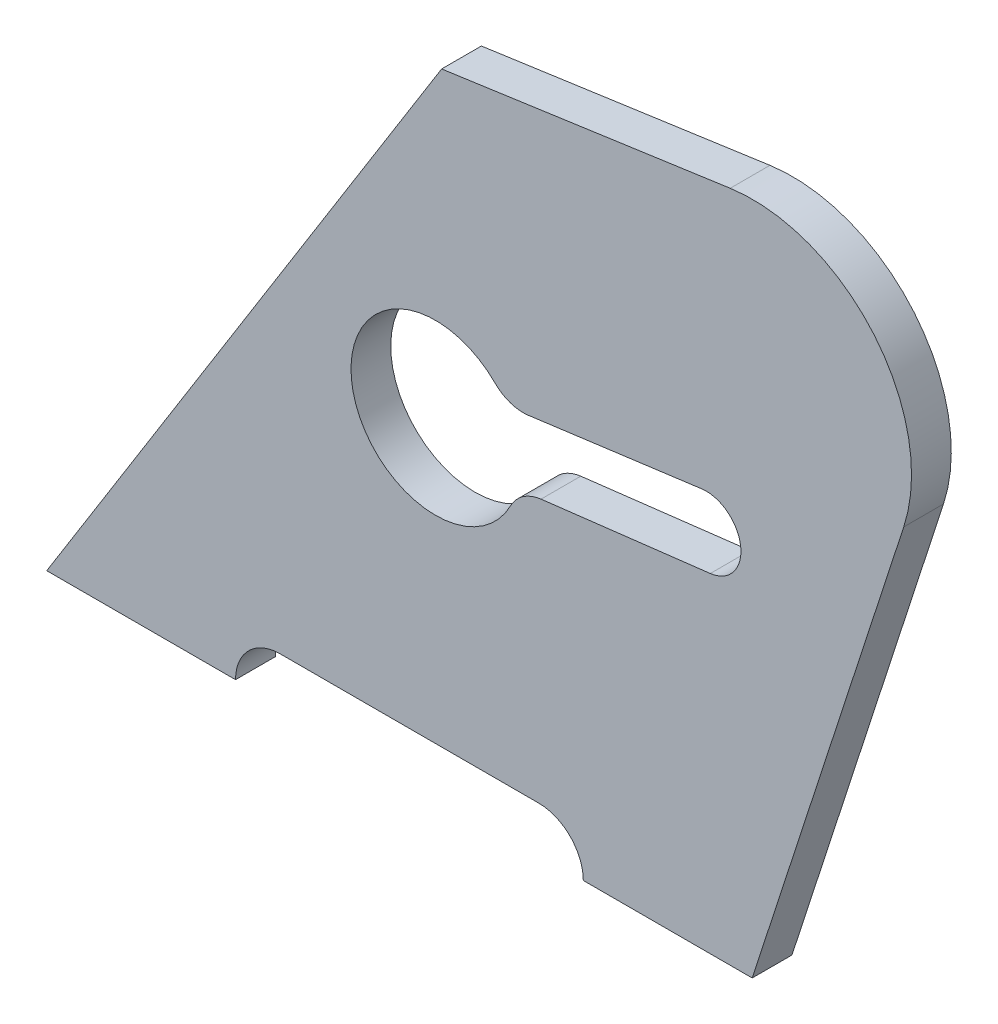
ISO-10303-21;
HEADER;
FILE_DESCRIPTION(('STEP AP214'),'2;1');
FILE_NAME('part.step','',(''),(''),'','','');
FILE_SCHEMA(('AUTOMOTIVE_DESIGN { 1 0 10303 214 1 1 1 1 }'));
ENDSEC;
DATA;
#1=APPLICATION_CONTEXT('core data for automotive mechanical design processes');
#2=APPLICATION_PROTOCOL_DEFINITION('international standard','automotive_design',2000,#1);
#3=PRODUCT_CONTEXT('',#1,'mechanical');
#4=PRODUCT('Part','Part','',(#3));
#5=PRODUCT_RELATED_PRODUCT_CATEGORY('part','',(#4));
#6=PRODUCT_DEFINITION_FORMATION('','',#4);
#7=PRODUCT_DEFINITION_CONTEXT('part definition',#1,'design');
#8=PRODUCT_DEFINITION('design','',#6,#7);
#9=PRODUCT_DEFINITION_SHAPE('','',#8);
#10=(LENGTH_UNIT() NAMED_UNIT(*) SI_UNIT(.MILLI.,.METRE.));
#11=(NAMED_UNIT(*) PLANE_ANGLE_UNIT() SI_UNIT($,.RADIAN.));
#12=(NAMED_UNIT(*) SI_UNIT($,.STERADIAN.) SOLID_ANGLE_UNIT());
#13=UNCERTAINTY_MEASURE_WITH_UNIT(LENGTH_MEASURE(1.E-05),#10,'distance_accuracy_value','');
#14=(GEOMETRIC_REPRESENTATION_CONTEXT(3) GLOBAL_UNCERTAINTY_ASSIGNED_CONTEXT((#13)) GLOBAL_UNIT_ASSIGNED_CONTEXT((#10,
#11,#12)) REPRESENTATION_CONTEXT('',''));
#15=CARTESIAN_POINT('',(0.,0.,0.));
#16=DIRECTION('',(0.,0.,1.));
#17=DIRECTION('',(1.,0.,0.));
#18=AXIS2_PLACEMENT_3D('',#15,#16,#17);
#19=CARTESIAN_POINT('',(100.444452501199,54.2812565209508,8.));
#20=DIRECTION('',(0.,0.,-1.));
#21=DIRECTION('',(-1.,0.,0.));
#22=AXIS2_PLACEMENT_3D('',#19,#20,#21);
#23=CYLINDRICAL_SURFACE('',#22,7.99999999999999);
#24=CARTESIAN_POINT('',(100.444452501199,54.2812565209508,0.));
#25=DIRECTION('',(0.,0.,1.));
#26=DIRECTION('',(1.,0.,0.));
#27=AXIS2_PLACEMENT_3D('',#24,#25,#26);
#28=CIRCLE('',#27,7.99999999999999);
#29=CARTESIAN_POINT('',(99.4956641977497,62.2247948229443,0.));
#30=VERTEX_POINT('',#29);
#31=CARTESIAN_POINT('',(93.3405180268182,57.9601306671678,0.));
#32=VERTEX_POINT('',#31);
#33=EDGE_CURVE('E204',#30,#32,#28,.T.);
#34=ORIENTED_EDGE('',*,*,#33,.T.);
#35=DIRECTION('',(0.,0.,-1.));
#36=VECTOR('',#35,1.);
#37=CARTESIAN_POINT('',(93.3405180268182,57.9601306671678,8.));
#38=LINE('',#37,#36);
#39=CARTESIAN_POINT('',(93.3405180268182,57.9601306671678,8.));
#40=VERTEX_POINT('',#39);
#41=EDGE_CURVE('E11',#40,#32,#38,.T.);
#42=ORIENTED_EDGE('',*,*,#41,.F.);
#43=CARTESIAN_POINT('',(100.444452501199,54.2812565209508,8.));
#44=DIRECTION('',(0.,0.,1.));
#45=DIRECTION('',(1.,0.,0.));
#46=AXIS2_PLACEMENT_3D('',#43,#44,#45);
#47=CIRCLE('',#46,7.99999999999999);
#48=CARTESIAN_POINT('',(99.4956641977497,62.2247948229443,8.));
#49=VERTEX_POINT('',#48);
#50=EDGE_CURVE('E301',#49,#40,#47,.T.);
#51=ORIENTED_EDGE('',*,*,#50,.F.);
#52=DIRECTION('',(0.,0.,-1.));
#53=VECTOR('',#52,1.);
#54=CARTESIAN_POINT('',(99.4956641977497,62.2247948229443,8.));
#55=LINE('',#54,#53);
#56=EDGE_CURVE('E216',#49,#30,#55,.T.);
#57=ORIENTED_EDGE('',*,*,#56,.T.);
#58=EDGE_LOOP('',(#34,#42,#51,#57));
#59=FACE_BOUND('',#58,.T.);
#60=ADVANCED_FACE('F43',(#59),#23,.T.);
#61=CARTESIAN_POINT('',(78.244657268759,65.7777382278788,8.));
#62=DIRECTION('',(0.,0.,-1.));
#63=DIRECTION('',(-1.,0.,0.));
#64=AXIS2_PLACEMENT_3D('',#61,#62,#63);
#65=CYLINDRICAL_SURFACE('',#64,17.);
#66=CARTESIAN_POINT('',(78.244657268759,65.7777382278788,0.));
#67=DIRECTION('',(0.,0.,1.));
#68=DIRECTION('',(1.,0.,0.));
#69=AXIS2_PLACEMENT_3D('',#66,#67,#68);
#70=CIRCLE('',#69,17.);
#71=CARTESIAN_POINT('',(90.2430889891393,77.8208954655542,0.));
#72=VERTEX_POINT('',#71);
#73=EDGE_CURVE('E210',#72,#32,#70,.T.);
#74=ORIENTED_EDGE('',*,*,#73,.F.);
#75=DIRECTION('',(0.,0.,-1.));
#76=VECTOR('',#75,1.);
#77=CARTESIAN_POINT('',(90.2430889891393,77.8208954655542,8.));
#78=LINE('',#77,#76);
#79=CARTESIAN_POINT('',(90.2430889891393,77.8208954655542,8.));
#80=VERTEX_POINT('',#79);
#81=EDGE_CURVE('E52',#80,#72,#78,.T.);
#82=ORIENTED_EDGE('',*,*,#81,.F.);
#83=CARTESIAN_POINT('',(78.244657268759,65.7777382278788,8.));
#84=DIRECTION('',(0.,0.,1.));
#85=DIRECTION('',(1.,0.,0.));
#86=AXIS2_PLACEMENT_3D('',#83,#84,#85);
#87=CIRCLE('',#86,17.);
#88=EDGE_CURVE('E304',#80,#40,#87,.T.);
#89=ORIENTED_EDGE('',*,*,#88,.T.);
#90=ORIENTED_EDGE('',*,*,#41,.T.);
#91=EDGE_LOOP('',(#74,#82,#89,#90));
#92=FACE_BOUND('',#91,.T.);
#93=ADVANCED_FACE('F330',(#92),#65,.F.);
#94=CARTESIAN_POINT('',(95.88940979873,83.4882635774014,8.));
#95=DIRECTION('',(0.,0.,-1.));
#96=DIRECTION('',(-1.,0.,0.));
#97=AXIS2_PLACEMENT_3D('',#94,#95,#96);
#98=CYLINDRICAL_SURFACE('',#97,8.00000000000002);
#99=CARTESIAN_POINT('',(95.88940979873,83.4882635774014,0.));
#100=DIRECTION('',(0.,0.,1.));
#101=DIRECTION('',(1.,0.,0.));
#102=AXIS2_PLACEMENT_3D('',#99,#100,#101);
#103=CIRCLE('',#102,8.00000000000002);
#104=CARTESIAN_POINT('',(96.941453956969,75.5577400707774,0.));
#105=VERTEX_POINT('',#104);
#106=EDGE_CURVE('E206',#105,#72,#103,.F.);
#107=ORIENTED_EDGE('',*,*,#106,.F.);
#108=DIRECTION('',(0.,0.,-1.));
#109=VECTOR('',#108,1.);
#110=CARTESIAN_POINT('',(96.941453956969,75.5577400707774,8.));
#111=LINE('',#110,#109);
#112=CARTESIAN_POINT('',(96.941453956969,75.5577400707774,8.));
#113=VERTEX_POINT('',#112);
#114=EDGE_CURVE('E167',#113,#105,#111,.T.);
#115=ORIENTED_EDGE('',*,*,#114,.F.);
#116=CARTESIAN_POINT('',(95.88940979873,83.4882635774014,8.));
#117=DIRECTION('',(0.,0.,1.));
#118=DIRECTION('',(1.,0.,0.));
#119=AXIS2_PLACEMENT_3D('',#116,#117,#118);
#120=CIRCLE('',#119,8.00000000000002);
#121=EDGE_CURVE('E174',#113,#80,#120,.F.);
#122=ORIENTED_EDGE('',*,*,#121,.T.);
#123=ORIENTED_EDGE('',*,*,#81,.T.);
#124=EDGE_LOOP('',(#107,#115,#122,#123));
#125=FACE_BOUND('',#124,.T.);
#126=ADVANCED_FACE('F309',(#125),#98,.T.);
#127=CARTESIAN_POINT('',(-8.17349122941711,61.6134444723113,8.));
#128=DIRECTION('',(0.131505519779873,-0.991315438327995,0.));
#129=DIRECTION('',(0.991315438327995,0.131505519779873,0.));
#130=AXIS2_PLACEMENT_3D('',#127,#128,#129);
#131=PLANE('',#130);
#132=DIRECTION('',(-0.991315438327995,-0.131505519779873,0.));
#133=VECTOR('',#132,1.);
#134=CARTESIAN_POINT('',(-8.17349122941711,61.6134444723113,0.));
#135=LINE('',#134,#133);
#136=CARTESIAN_POINT('',(131.814885043741,80.183965492333,0.));
#137=VERTEX_POINT('',#136);
#138=EDGE_CURVE('E165',#137,#105,#135,.T.);
#139=ORIENTED_EDGE('',*,*,#138,.F.);
#140=DIRECTION('',(0.,0.,-1.));
#141=VECTOR('',#140,1.);
#142=CARTESIAN_POINT('',(131.814885043741,80.183965492333,8.));
#143=LINE('',#142,#141);
#144=CARTESIAN_POINT('',(131.814885043741,80.183965492333,8.));
#145=VERTEX_POINT('',#144);
#146=EDGE_CURVE('E160',#145,#137,#143,.T.);
#147=ORIENTED_EDGE('',*,*,#146,.F.);
#148=DIRECTION('',(-0.991315438327995,-0.131505519779873,0.));
#149=VECTOR('',#148,1.);
#150=CARTESIAN_POINT('',(-8.17349122941711,61.6134444723113,8.));
#151=LINE('',#150,#149);
#152=EDGE_CURVE('E158',#145,#113,#151,.T.);
#153=ORIENTED_EDGE('',*,*,#152,.T.);
#154=ORIENTED_EDGE('',*,*,#114,.T.);
#155=EDGE_LOOP('',(#139,#147,#153,#154));
#156=FACE_BOUND('',#155,.T.);
#157=ADVANCED_FACE('F159',(#156),#131,.T.);
#158=CARTESIAN_POINT('',(132.7354236822,73.244757424037,8.));
#159=DIRECTION('',(0.,0.,-1.));
#160=DIRECTION('',(-1.,0.,0.));
#161=AXIS2_PLACEMENT_3D('',#158,#159,#160);
#162=CYLINDRICAL_SURFACE('',#161,6.99999999999999);
#163=CARTESIAN_POINT('',(132.7354236822,73.244757424037,0.));
#164=DIRECTION('',(0.,0.,1.));
#165=DIRECTION('',(1.,0.,0.));
#166=AXIS2_PLACEMENT_3D('',#163,#164,#165);
#167=CIRCLE('',#166,6.99999999999999);
#168=CARTESIAN_POINT('',(133.565613447718,66.2941614097928,0.));
#169=VERTEX_POINT('',#168);
#170=EDGE_CURVE('E215',#169,#137,#167,.T.);
#171=ORIENTED_EDGE('',*,*,#170,.F.);
#172=DIRECTION('',(0.,0.,-1.));
#173=VECTOR('',#172,1.);
#174=CARTESIAN_POINT('',(133.565613447718,66.2941614097928,8.));
#175=LINE('',#174,#173);
#176=CARTESIAN_POINT('',(133.565613447718,66.2941614097928,8.));
#177=VERTEX_POINT('',#176);
#178=EDGE_CURVE('E106',#177,#169,#175,.T.);
#179=ORIENTED_EDGE('',*,*,#178,.F.);
#180=CARTESIAN_POINT('',(132.7354236822,73.244757424037,8.));
#181=DIRECTION('',(0.,0.,1.));
#182=DIRECTION('',(1.,0.,0.));
#183=AXIS2_PLACEMENT_3D('',#180,#181,#182);
#184=CIRCLE('',#183,6.99999999999999);
#185=EDGE_CURVE('E173',#177,#145,#184,.T.);
#186=ORIENTED_EDGE('',*,*,#185,.T.);
#187=ORIENTED_EDGE('',*,*,#146,.T.);
#188=EDGE_LOOP('',(#171,#179,#186,#187));
#189=FACE_BOUND('',#188,.T.);
#190=ADVANCED_FACE('F176',(#189),#162,.F.);
#191=CARTESIAN_POINT('',(0.,0.,8.));
#192=DIRECTION('',(-0.848048096156428,0.529919264233202,0.));
#193=DIRECTION('',(-0.529919264233202,-0.848048096156428,0.));
#194=AXIS2_PLACEMENT_3D('',#191,#192,#193);
#195=PLANE('',#194);
#196=DIRECTION('',(0.529919264233202,0.848048096156428,0.));
#197=VECTOR('',#196,1.);
#198=CARTESIAN_POINT('',(0.,0.,0.));
#199=LINE('',#198,#197);
#200=CARTESIAN_POINT('',(0.,0.,0.));
#201=VERTEX_POINT('',#200);
#202=CARTESIAN_POINT('',(79.4878896349804,127.207214423464,0.));
#203=VERTEX_POINT('',#202);
#204=EDGE_CURVE('E185',#201,#203,#199,.T.);
#205=ORIENTED_EDGE('',*,*,#204,.F.);
#206=DIRECTION('',(0.,0.,-1.));
#207=VECTOR('',#206,1.);
#208=CARTESIAN_POINT('',(0.,0.,8.));
#209=LINE('',#208,#207);
#210=CARTESIAN_POINT('',(0.,0.,8.));
#211=VERTEX_POINT('',#210);
#212=EDGE_CURVE('E50',#211,#201,#209,.T.);
#213=ORIENTED_EDGE('',*,*,#212,.F.);
#214=DIRECTION('',(0.529919264233202,0.848048096156428,0.));
#215=VECTOR('',#214,1.);
#216=CARTESIAN_POINT('',(0.,0.,8.));
#217=LINE('',#216,#215);
#218=CARTESIAN_POINT('',(79.4878896349804,127.207214423464,8.));
#219=VERTEX_POINT('',#218);
#220=EDGE_CURVE('E220',#211,#219,#217,.T.);
#221=ORIENTED_EDGE('',*,*,#220,.T.);
#222=DIRECTION('',(0.,0.,-1.));
#223=VECTOR('',#222,1.);
#224=CARTESIAN_POINT('',(79.4878896349804,127.207214423464,8.));
#225=LINE('',#224,#223);
#226=EDGE_CURVE('E178',#219,#203,#225,.T.);
#227=ORIENTED_EDGE('',*,*,#226,.T.);
#228=EDGE_LOOP('',(#205,#213,#221,#227));
#229=FACE_BOUND('',#228,.T.);
#230=ADVANCED_FACE('F44',(#229),#195,.T.);
#231=CARTESIAN_POINT('',(0.,0.,8.));
#232=DIRECTION('',(0.,1.,0.));
#233=DIRECTION('',(0.,0.,1.));
#234=AXIS2_PLACEMENT_3D('',#231,#232,#233);
#235=PLANE('',#234);
#236=DIRECTION('',(1.,0.,0.));
#237=VECTOR('',#236,1.);
#238=CARTESIAN_POINT('',(0.,0.,0.));
#239=LINE('',#238,#237);
#240=CARTESIAN_POINT('',(38.,0.,0.));
#241=VERTEX_POINT('',#240);
#242=EDGE_CURVE('E184',#201,#241,#239,.T.);
#243=ORIENTED_EDGE('',*,*,#242,.T.);
#244=DIRECTION('',(0.,0.,-1.));
#245=VECTOR('',#244,1.);
#246=CARTESIAN_POINT('',(38.,0.,8.));
#247=LINE('',#246,#245);
#248=CARTESIAN_POINT('',(38.,0.,8.));
#249=VERTEX_POINT('',#248);
#250=EDGE_CURVE('E236',#249,#241,#247,.T.);
#251=ORIENTED_EDGE('',*,*,#250,.F.);
#252=DIRECTION('',(1.,0.,0.));
#253=VECTOR('',#252,1.);
#254=CARTESIAN_POINT('',(0.,0.,8.));
#255=LINE('',#254,#253);
#256=EDGE_CURVE('E246',#211,#249,#255,.T.);
#257=ORIENTED_EDGE('',*,*,#256,.F.);
#258=ORIENTED_EDGE('',*,*,#212,.T.);
#259=EDGE_LOOP('',(#243,#251,#257,#258));
#260=FACE_BOUND('',#259,.T.);
#261=ADVANCED_FACE('F250',(#260),#235,.F.);
#262=CARTESIAN_POINT('',(47.,0.,8.));
#263=DIRECTION('',(0.,0.,-1.));
#264=DIRECTION('',(-1.,0.,0.));
#265=AXIS2_PLACEMENT_3D('',#262,#263,#264);
#266=CYLINDRICAL_SURFACE('',#265,9.);
#267=CARTESIAN_POINT('',(47.,0.,0.));
#268=DIRECTION('',(0.,0.,1.));
#269=DIRECTION('',(1.,0.,0.));
#270=AXIS2_PLACEMENT_3D('',#267,#268,#269);
#271=CIRCLE('',#270,9.);
#272=CARTESIAN_POINT('',(47.,9.,0.));
#273=VERTEX_POINT('',#272);
#274=EDGE_CURVE('E190',#241,#273,#271,.F.);
#275=ORIENTED_EDGE('',*,*,#274,.T.);
#276=DIRECTION('',(0.,0.,-1.));
#277=VECTOR('',#276,1.);
#278=CARTESIAN_POINT('',(47.,9.,8.));
#279=LINE('',#278,#277);
#280=CARTESIAN_POINT('',(47.,9.,8.));
#281=VERTEX_POINT('',#280);
#282=EDGE_CURVE('E240',#281,#273,#279,.T.);
#283=ORIENTED_EDGE('',*,*,#282,.F.);
#284=CARTESIAN_POINT('',(47.,0.,8.));
#285=DIRECTION('',(0.,0.,1.));
#286=DIRECTION('',(1.,0.,0.));
#287=AXIS2_PLACEMENT_3D('',#284,#285,#286);
#288=CIRCLE('',#287,9.);
#289=EDGE_CURVE('E289',#249,#281,#288,.F.);
#290=ORIENTED_EDGE('',*,*,#289,.F.);
#291=ORIENTED_EDGE('',*,*,#250,.T.);
#292=EDGE_LOOP('',(#275,#283,#290,#291));
#293=FACE_BOUND('',#292,.T.);
#294=ADVANCED_FACE('F288',(#293),#266,.F.);
#295=CARTESIAN_POINT('',(0.,9.,8.));
#296=DIRECTION('',(0.,1.,0.));
#297=DIRECTION('',(-1.,0.,0.));
#298=AXIS2_PLACEMENT_3D('',#295,#296,#297);
#299=PLANE('',#298);
#300=DIRECTION('',(1.,0.,0.));
#301=VECTOR('',#300,1.);
#302=CARTESIAN_POINT('',(0.,9.,0.));
#303=LINE('',#302,#301);
#304=CARTESIAN_POINT('',(99.,9.,0.));
#305=VERTEX_POINT('',#304);
#306=EDGE_CURVE('E188',#273,#305,#303,.T.);
#307=ORIENTED_EDGE('',*,*,#306,.T.);
#308=DIRECTION('',(0.,0.,-1.));
#309=VECTOR('',#308,1.);
#310=CARTESIAN_POINT('',(99.,9.,8.));
#311=LINE('',#310,#309);
#312=CARTESIAN_POINT('',(99.,9.,8.));
#313=VERTEX_POINT('',#312);
#314=EDGE_CURVE('E233',#313,#305,#311,.T.);
#315=ORIENTED_EDGE('',*,*,#314,.F.);
#316=DIRECTION('',(1.,0.,0.));
#317=VECTOR('',#316,1.);
#318=CARTESIAN_POINT('',(0.,9.,8.));
#319=LINE('',#318,#317);
#320=EDGE_CURVE('E287',#281,#313,#319,.T.);
#321=ORIENTED_EDGE('',*,*,#320,.F.);
#322=ORIENTED_EDGE('',*,*,#282,.T.);
#323=EDGE_LOOP('',(#307,#315,#321,#322));
#324=FACE_BOUND('',#323,.T.);
#325=ADVANCED_FACE('F283',(#324),#299,.F.);
#326=CARTESIAN_POINT('',(99.,0.,8.));
#327=DIRECTION('',(0.,0.,-1.));
#328=DIRECTION('',(-1.,0.,0.));
#329=AXIS2_PLACEMENT_3D('',#326,#327,#328);
#330=CYLINDRICAL_SURFACE('',#329,9.);
#331=CARTESIAN_POINT('',(99.,0.,0.));
#332=DIRECTION('',(0.,0.,1.));
#333=DIRECTION('',(1.,0.,0.));
#334=AXIS2_PLACEMENT_3D('',#331,#332,#333);
#335=CIRCLE('',#334,9.);
#336=CARTESIAN_POINT('',(108.,0.,0.));
#337=VERTEX_POINT('',#336);
#338=EDGE_CURVE('E192',#305,#337,#335,.F.);
#339=ORIENTED_EDGE('',*,*,#338,.T.);
#340=DIRECTION('',(0.,0.,-1.));
#341=VECTOR('',#340,1.);
#342=CARTESIAN_POINT('',(108.,0.,8.));
#343=LINE('',#342,#341);
#344=CARTESIAN_POINT('',(108.,0.,8.));
#345=VERTEX_POINT('',#344);
#346=EDGE_CURVE('E231',#345,#337,#343,.T.);
#347=ORIENTED_EDGE('',*,*,#346,.F.);
#348=CARTESIAN_POINT('',(99.,0.,8.));
#349=DIRECTION('',(0.,0.,1.));
#350=DIRECTION('',(1.,0.,0.));
#351=AXIS2_PLACEMENT_3D('',#348,#349,#350);
#352=CIRCLE('',#351,9.);
#353=EDGE_CURVE('E282',#313,#345,#352,.F.);
#354=ORIENTED_EDGE('',*,*,#353,.F.);
#355=ORIENTED_EDGE('',*,*,#314,.T.);
#356=EDGE_LOOP('',(#339,#347,#354,#355));
#357=FACE_BOUND('',#356,.T.);
#358=ADVANCED_FACE('F279',(#357),#330,.F.);
#359=CARTESIAN_POINT('',(0.,0.,8.));
#360=DIRECTION('',(0.,1.,0.));
#361=DIRECTION('',(0.,0.,1.));
#362=AXIS2_PLACEMENT_3D('',#359,#360,#361);
#363=PLANE('',#362);
#364=DIRECTION('',(1.,0.,0.));
#365=VECTOR('',#364,1.);
#366=CARTESIAN_POINT('',(0.,0.,0.));
#367=LINE('',#366,#365);
#368=CARTESIAN_POINT('',(142.,0.,0.));
#369=VERTEX_POINT('',#368);
#370=EDGE_CURVE('E194',#337,#369,#367,.T.);
#371=ORIENTED_EDGE('',*,*,#370,.T.);
#372=DIRECTION('',(0.,0.,-1.));
#373=VECTOR('',#372,1.);
#374=CARTESIAN_POINT('',(142.,0.,8.));
#375=LINE('',#374,#373);
#376=CARTESIAN_POINT('',(142.,0.,8.));
#377=VERTEX_POINT('',#376);
#378=EDGE_CURVE('E228',#377,#369,#375,.T.);
#379=ORIENTED_EDGE('',*,*,#378,.F.);
#380=DIRECTION('',(1.,0.,0.));
#381=VECTOR('',#380,1.);
#382=CARTESIAN_POINT('',(0.,0.,8.));
#383=LINE('',#382,#381);
#384=EDGE_CURVE('E280',#345,#377,#383,.T.);
#385=ORIENTED_EDGE('',*,*,#384,.F.);
#386=ORIENTED_EDGE('',*,*,#346,.T.);
#387=EDGE_LOOP('',(#371,#379,#385,#386));
#388=FACE_BOUND('',#387,.T.);
#389=ADVANCED_FACE('F272',(#388),#363,.F.);
#390=CARTESIAN_POINT('',(128.440206600621,-41.7327529127653,8.));
#391=DIRECTION('',(-0.951056516295154,0.309016994374945,0.));
#392=DIRECTION('',(-0.309016994374945,-0.951056516295154,0.));
#393=AXIS2_PLACEMENT_3D('',#390,#391,#392);
#394=PLANE('',#393);
#395=DIRECTION('',(0.309016994374945,0.951056516295154,0.));
#396=VECTOR('',#395,1.);
#397=CARTESIAN_POINT('',(128.440206600621,-41.7327529127653,0.));
#398=LINE('',#397,#396);
#399=CARTESIAN_POINT('',(172.503548140475,93.8802679373739,0.));
#400=VERTEX_POINT('',#399);
#401=EDGE_CURVE('E193',#369,#400,#398,.T.);
#402=ORIENTED_EDGE('',*,*,#401,.T.);
#403=DIRECTION('',(0.,0.,-1.));
#404=VECTOR('',#403,1.);
#405=CARTESIAN_POINT('',(172.503548140475,93.8802679373739,8.));
#406=LINE('',#405,#404);
#407=CARTESIAN_POINT('',(172.503548140475,93.8802679373739,8.));
#408=VERTEX_POINT('',#407);
#409=EDGE_CURVE('E226',#408,#400,#406,.T.);
#410=ORIENTED_EDGE('',*,*,#409,.F.);
#411=DIRECTION('',(0.309016994374945,0.951056516295154,0.));
#412=VECTOR('',#411,1.);
#413=CARTESIAN_POINT('',(128.440206600621,-41.7327529127653,8.));
#414=LINE('',#413,#412);
#415=EDGE_CURVE('E298',#377,#408,#414,.T.);
#416=ORIENTED_EDGE('',*,*,#415,.F.);
#417=ORIENTED_EDGE('',*,*,#378,.T.);
#418=EDGE_LOOP('',(#402,#410,#416,#417));
#419=FACE_BOUND('',#418,.T.);
#420=ADVANCED_FACE('F267',(#419),#394,.F.);
#421=CARTESIAN_POINT('',(142.06973961903,103.768811757372,8.));
#422=DIRECTION('',(0.,0.,-1.));
#423=DIRECTION('',(-1.,0.,0.));
#424=AXIS2_PLACEMENT_3D('',#421,#422,#423);
#425=CYLINDRICAL_SURFACE('',#424,32.);
#426=CARTESIAN_POINT('',(142.06973961903,103.768811757372,0.));
#427=DIRECTION('',(0.,0.,1.));
#428=DIRECTION('',(1.,0.,0.));
#429=AXIS2_PLACEMENT_3D('',#426,#427,#428);
#430=CIRCLE('',#429,32.);
#431=CARTESIAN_POINT('',(137.573015723534,135.451290735629,0.));
#432=VERTEX_POINT('',#431);
#433=EDGE_CURVE('E198',#432,#400,#430,.F.);
#434=ORIENTED_EDGE('',*,*,#433,.F.);
#435=DIRECTION('',(0.,0.,-1.));
#436=VECTOR('',#435,1.);
#437=CARTESIAN_POINT('',(137.573015723534,135.451290735629,8.));
#438=LINE('',#437,#436);
#439=CARTESIAN_POINT('',(137.573015723534,135.451290735629,8.));
#440=VERTEX_POINT('',#439);
#441=EDGE_CURVE('E222',#440,#432,#438,.T.);
#442=ORIENTED_EDGE('',*,*,#441,.F.);
#443=CARTESIAN_POINT('',(142.06973961903,103.768811757372,8.));
#444=DIRECTION('',(0.,0.,1.));
#445=DIRECTION('',(1.,0.,0.));
#446=AXIS2_PLACEMENT_3D('',#443,#444,#445);
#447=CIRCLE('',#446,32.);
#448=EDGE_CURVE('E266',#440,#408,#447,.F.);
#449=ORIENTED_EDGE('',*,*,#448,.T.);
#450=ORIENTED_EDGE('',*,*,#409,.T.);
#451=EDGE_LOOP('',(#434,#442,#449,#450));
#452=FACE_BOUND('',#451,.T.);
#453=ADVANCED_FACE('F265',(#452),#425,.T.);
#454=CARTESIAN_POINT('',(-16.1285050060773,113.636290037191,8.));
#455=DIRECTION('',(0.140522621734251,-0.990077468070521,0.));
#456=DIRECTION('',(0.990077468070521,0.140522621734251,0.));
#457=AXIS2_PLACEMENT_3D('',#454,#455,#456);
#458=PLANE('',#457);
#459=DIRECTION('',(-0.990077468070521,-0.140522621734251,0.));
#460=VECTOR('',#459,1.);
#461=CARTESIAN_POINT('',(-16.1285050060773,113.636290037191,0.));
#462=LINE('',#461,#460);
#463=EDGE_CURVE('E202',#432,#203,#462,.T.);
#464=ORIENTED_EDGE('',*,*,#463,.T.);
#465=ORIENTED_EDGE('',*,*,#226,.F.);
#466=DIRECTION('',(-0.990077468070521,-0.140522621734251,0.));
#467=VECTOR('',#466,1.);
#468=CARTESIAN_POINT('',(-16.1285050060773,113.636290037191,8.));
#469=LINE('',#468,#467);
#470=EDGE_CURVE('E303',#440,#219,#469,.T.);
#471=ORIENTED_EDGE('',*,*,#470,.F.);
#472=ORIENTED_EDGE('',*,*,#441,.T.);
#473=EDGE_LOOP('',(#464,#465,#471,#472));
#474=FACE_BOUND('',#473,.T.);
#475=ADVANCED_FACE('F256',(#474),#458,.F.);
#476=CARTESIAN_POINT('',(-5.92821787050144,49.6328059122244,8.));
#477=DIRECTION('',(0.118598537931169,-0.992942287749187,0.));
#478=DIRECTION('',(0.992942287749187,0.118598537931169,0.));
#479=AXIS2_PLACEMENT_3D('',#476,#477,#478);
#480=PLANE('',#479);
#481=DIRECTION('',(-0.992942287749187,-0.118598537931169,0.));
#482=VECTOR('',#481,1.);
#483=CARTESIAN_POINT('',(-5.92821787050144,49.6328059122244,0.));
#484=LINE('',#483,#482);
#485=EDGE_CURVE('E111',#169,#30,#484,.T.);
#486=ORIENTED_EDGE('',*,*,#485,.T.);
#487=ORIENTED_EDGE('',*,*,#56,.F.);
#488=DIRECTION('',(-0.992942287749187,-0.118598537931169,0.));
#489=VECTOR('',#488,1.);
#490=CARTESIAN_POINT('',(-5.92821787050144,49.6328059122244,8.));
#491=LINE('',#490,#489);
#492=EDGE_CURVE('E65',#177,#49,#491,.T.);
#493=ORIENTED_EDGE('',*,*,#492,.F.);
#494=ORIENTED_EDGE('',*,*,#178,.T.);
#495=EDGE_LOOP('',(#486,#487,#493,#494));
#496=FACE_BOUND('',#495,.T.);
#497=ADVANCED_FACE('F314',(#496),#480,.F.);
#498=CARTESIAN_POINT('',(0.,0.,8.));
#499=DIRECTION('',(0.,0.,1.));
#500=DIRECTION('',(1.,0.,0.));
#501=AXIS2_PLACEMENT_3D('',#498,#499,#500);
#502=PLANE('',#501);
#503=ORIENTED_EDGE('',*,*,#220,.F.);
#504=ORIENTED_EDGE('',*,*,#256,.T.);
#505=ORIENTED_EDGE('',*,*,#289,.T.);
#506=ORIENTED_EDGE('',*,*,#320,.T.);
#507=ORIENTED_EDGE('',*,*,#353,.T.);
#508=ORIENTED_EDGE('',*,*,#384,.T.);
#509=ORIENTED_EDGE('',*,*,#415,.T.);
#510=ORIENTED_EDGE('',*,*,#448,.F.);
#511=ORIENTED_EDGE('',*,*,#470,.T.);
#512=EDGE_LOOP('',(#503,#504,#505,#506,#507,#508,#509,#510,#511));
#513=FACE_BOUND('',#512,.T.);
#514=ORIENTED_EDGE('',*,*,#50,.T.);
#515=ORIENTED_EDGE('',*,*,#88,.F.);
#516=ORIENTED_EDGE('',*,*,#121,.F.);
#517=ORIENTED_EDGE('',*,*,#152,.F.);
#518=ORIENTED_EDGE('',*,*,#185,.F.);
#519=ORIENTED_EDGE('',*,*,#492,.T.);
#520=EDGE_LOOP('',(#514,#515,#516,#517,#518,#519));
#521=FACE_BOUND('',#520,.T.);
#522=ADVANCED_FACE('F169',(#513,#521),#502,.T.);
#523=CARTESIAN_POINT('',(0.,0.,0.));
#524=DIRECTION('',(0.,0.,1.));
#525=DIRECTION('',(1.,0.,0.));
#526=AXIS2_PLACEMENT_3D('',#523,#524,#525);
#527=PLANE('',#526);
#528=ORIENTED_EDGE('',*,*,#204,.T.);
#529=ORIENTED_EDGE('',*,*,#463,.F.);
#530=ORIENTED_EDGE('',*,*,#433,.T.);
#531=ORIENTED_EDGE('',*,*,#401,.F.);
#532=ORIENTED_EDGE('',*,*,#370,.F.);
#533=ORIENTED_EDGE('',*,*,#338,.F.);
#534=ORIENTED_EDGE('',*,*,#306,.F.);
#535=ORIENTED_EDGE('',*,*,#274,.F.);
#536=ORIENTED_EDGE('',*,*,#242,.F.);
#537=EDGE_LOOP('',(#528,#529,#530,#531,#532,#533,#534,#535,#536));
#538=FACE_BOUND('',#537,.T.);
#539=ORIENTED_EDGE('',*,*,#33,.F.);
#540=ORIENTED_EDGE('',*,*,#485,.F.);
#541=ORIENTED_EDGE('',*,*,#170,.T.);
#542=ORIENTED_EDGE('',*,*,#138,.T.);
#543=ORIENTED_EDGE('',*,*,#106,.T.);
#544=ORIENTED_EDGE('',*,*,#73,.T.);
#545=EDGE_LOOP('',(#539,#540,#541,#542,#543,#544));
#546=FACE_BOUND('',#545,.T.);
#547=ADVANCED_FACE('F252',(#538,#546),#527,.F.);
#548=CLOSED_SHELL('',(#60,#93,#126,#157,#190,#230,#261,#294,#325,#358,#389,#420,#453,#475,#497,
#522,#547));
#549=MANIFOLD_SOLID_BREP('B2',#548);
#550=ADVANCED_BREP_SHAPE_REPRESENTATION('',(#18,#549),#14);
#551=SHAPE_DEFINITION_REPRESENTATION(#9,#550);
ENDSEC;
END-ISO-10303-21;
